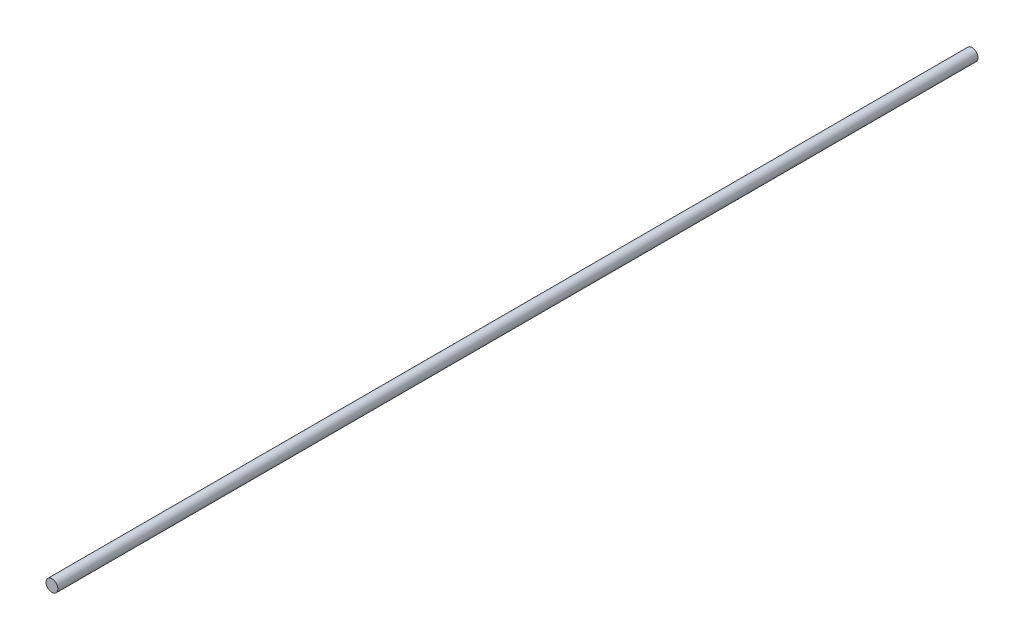
ISO-10303-21;
HEADER;
FILE_DESCRIPTION(('STEP AP214'),'2;1');
FILE_NAME('part.step','',(''),(''),'','','');
FILE_SCHEMA(('AUTOMOTIVE_DESIGN { 1 0 10303 214 1 1 1 1 }'));
ENDSEC;
DATA;
#1=APPLICATION_CONTEXT('core data for automotive mechanical design processes');
#2=APPLICATION_PROTOCOL_DEFINITION('international standard','automotive_design',2000,#1);
#3=PRODUCT_CONTEXT('',#1,'mechanical');
#4=PRODUCT('Part','Part','',(#3));
#5=PRODUCT_RELATED_PRODUCT_CATEGORY('part','',(#4));
#6=PRODUCT_DEFINITION_FORMATION('','',#4);
#7=PRODUCT_DEFINITION_CONTEXT('part definition',#1,'design');
#8=PRODUCT_DEFINITION('design','',#6,#7);
#9=PRODUCT_DEFINITION_SHAPE('','',#8);
#10=(LENGTH_UNIT() NAMED_UNIT(*) SI_UNIT(.MILLI.,.METRE.));
#11=(NAMED_UNIT(*) PLANE_ANGLE_UNIT() SI_UNIT($,.RADIAN.));
#12=(NAMED_UNIT(*) SI_UNIT($,.STERADIAN.) SOLID_ANGLE_UNIT());
#13=UNCERTAINTY_MEASURE_WITH_UNIT(LENGTH_MEASURE(1.E-05),#10,'distance_accuracy_value','');
#14=(GEOMETRIC_REPRESENTATION_CONTEXT(3) GLOBAL_UNCERTAINTY_ASSIGNED_CONTEXT((#13)) GLOBAL_UNIT_ASSIGNED_CONTEXT((#10,
#11,#12)) REPRESENTATION_CONTEXT('',''));
#15=CARTESIAN_POINT('',(0.,0.,0.));
#16=DIRECTION('',(0.,0.,1.));
#17=DIRECTION('',(1.,0.,0.));
#18=AXIS2_PLACEMENT_3D('',#15,#16,#17);
#19=CARTESIAN_POINT('',(0.,0.,620.));
#20=DIRECTION('',(0.,0.,-1.));
#21=DIRECTION('',(-1.,0.,0.));
#22=AXIS2_PLACEMENT_3D('',#19,#20,#21);
#23=CYLINDRICAL_SURFACE('',#22,4.);
#24=CARTESIAN_POINT('',(0.,0.,620.));
#25=DIRECTION('',(0.,0.,1.));
#26=DIRECTION('',(1.,0.,0.));
#27=AXIS2_PLACEMENT_3D('',#24,#25,#26);
#28=CIRCLE('',#27,4.);
#29=CARTESIAN_POINT('',(4.,0.,620.));
#30=VERTEX_POINT('',#29);
#31=EDGE_CURVE('E10',#30,#30,#28,.T.);
#32=ORIENTED_EDGE('',*,*,#31,.F.);
#33=EDGE_LOOP('',(#32));
#34=FACE_BOUND('',#33,.T.);
#35=CARTESIAN_POINT('',(0.,0.,0.));
#36=DIRECTION('',(0.,0.,1.));
#37=DIRECTION('',(1.,0.,0.));
#38=AXIS2_PLACEMENT_3D('',#35,#36,#37);
#39=CIRCLE('',#38,4.);
#40=CARTESIAN_POINT('',(4.,0.,0.));
#41=VERTEX_POINT('',#40);
#42=EDGE_CURVE('E40',#41,#41,#39,.T.);
#43=ORIENTED_EDGE('',*,*,#42,.T.);
#44=EDGE_LOOP('',(#43));
#45=FACE_BOUND('',#44,.T.);
#46=ADVANCED_FACE('F37',(#34,#45),#23,.T.);
#47=CARTESIAN_POINT('',(0.,0.,620.));
#48=DIRECTION('',(0.,0.,1.));
#49=DIRECTION('',(1.,0.,0.));
#50=AXIS2_PLACEMENT_3D('',#47,#48,#49);
#51=PLANE('',#50);
#52=ORIENTED_EDGE('',*,*,#31,.T.);
#53=EDGE_LOOP('',(#52));
#54=FACE_BOUND('',#53,.T.);
#55=ADVANCED_FACE('F52',(#54),#51,.T.);
#56=CARTESIAN_POINT('',(0.,0.,0.));
#57=DIRECTION('',(0.,0.,1.));
#58=DIRECTION('',(1.,0.,0.));
#59=AXIS2_PLACEMENT_3D('',#56,#57,#58);
#60=PLANE('',#59);
#61=ORIENTED_EDGE('',*,*,#42,.F.);
#62=EDGE_LOOP('',(#61));
#63=FACE_BOUND('',#62,.T.);
#64=ADVANCED_FACE('F50',(#63),#60,.F.);
#65=CLOSED_SHELL('',(#46,#55,#64));
#66=MANIFOLD_SOLID_BREP('B2',#65);
#67=ADVANCED_BREP_SHAPE_REPRESENTATION('',(#18,#66),#14);
#68=SHAPE_DEFINITION_REPRESENTATION(#9,#67);
ENDSEC;
END-ISO-10303-21;
